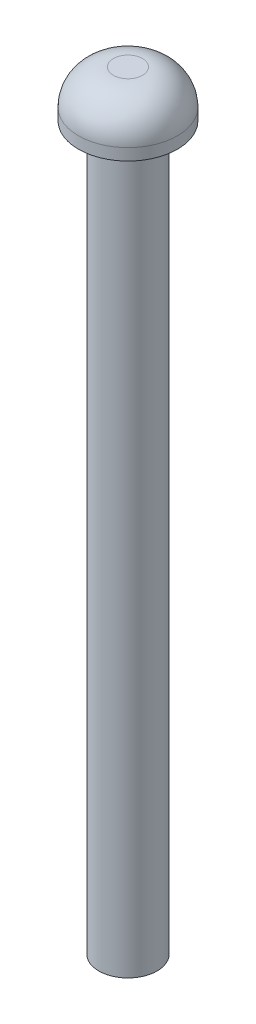
ISO-10303-21;
HEADER;
FILE_DESCRIPTION(('STEP AP214'),'2;1');
FILE_NAME('part.step','',(''),(''),'','','');
FILE_SCHEMA(('AUTOMOTIVE_DESIGN { 1 0 10303 214 1 1 1 1 }'));
ENDSEC;
DATA;
#1=APPLICATION_CONTEXT('core data for automotive mechanical design processes');
#2=APPLICATION_PROTOCOL_DEFINITION('international standard','automotive_design',2000,#1);
#3=PRODUCT_CONTEXT('',#1,'mechanical');
#4=PRODUCT('Part','Part','',(#3));
#5=PRODUCT_RELATED_PRODUCT_CATEGORY('part','',(#4));
#6=PRODUCT_DEFINITION_FORMATION('','',#4);
#7=PRODUCT_DEFINITION_CONTEXT('part definition',#1,'design');
#8=PRODUCT_DEFINITION('design','',#6,#7);
#9=PRODUCT_DEFINITION_SHAPE('','',#8);
#10=(LENGTH_UNIT() NAMED_UNIT(*) SI_UNIT(.MILLI.,.METRE.));
#11=(NAMED_UNIT(*) PLANE_ANGLE_UNIT() SI_UNIT($,.RADIAN.));
#12=(NAMED_UNIT(*) SI_UNIT($,.STERADIAN.) SOLID_ANGLE_UNIT());
#13=UNCERTAINTY_MEASURE_WITH_UNIT(LENGTH_MEASURE(1.E-05),#10,'distance_accuracy_value','');
#14=(GEOMETRIC_REPRESENTATION_CONTEXT(3) GLOBAL_UNCERTAINTY_ASSIGNED_CONTEXT((#13)) GLOBAL_UNIT_ASSIGNED_CONTEXT((#10,
#11,#12)) REPRESENTATION_CONTEXT('',''));
#15=CARTESIAN_POINT('',(0.,0.,0.));
#16=DIRECTION('',(0.,0.,1.));
#17=DIRECTION('',(1.,0.,0.));
#18=AXIS2_PLACEMENT_3D('',#15,#16,#17);
#19=CARTESIAN_POINT('',(0.,62.,0.));
#20=DIRECTION('',(0.,-1.,0.));
#21=DIRECTION('',(0.,0.,-1.));
#22=AXIS2_PLACEMENT_3D('',#19,#20,#21);
#23=CYLINDRICAL_SURFACE('',#22,2.5);
#24=CARTESIAN_POINT('',(0.,62.,0.));
#25=DIRECTION('',(0.,1.,0.));
#26=DIRECTION('',(0.,0.,1.));
#27=AXIS2_PLACEMENT_3D('',#24,#25,#26);
#28=CIRCLE('',#27,2.5);
#29=CARTESIAN_POINT('',(0.,62.,2.5));
#30=VERTEX_POINT('',#29);
#31=EDGE_CURVE('E50',#30,#30,#28,.T.);
#32=ORIENTED_EDGE('',*,*,#31,.F.);
#33=EDGE_LOOP('',(#32));
#34=FACE_BOUND('',#33,.T.);
#35=CARTESIAN_POINT('',(0.,0.,0.));
#36=DIRECTION('',(0.,1.,0.));
#37=DIRECTION('',(0.,0.,1.));
#38=AXIS2_PLACEMENT_3D('',#35,#36,#37);
#39=CIRCLE('',#38,2.5);
#40=CARTESIAN_POINT('',(0.,0.,2.5));
#41=VERTEX_POINT('',#40);
#42=EDGE_CURVE('E55',#41,#41,#39,.T.);
#43=ORIENTED_EDGE('',*,*,#42,.T.);
#44=EDGE_LOOP('',(#43));
#45=FACE_BOUND('',#44,.T.);
#46=ADVANCED_FACE('F37',(#34,#45),#23,.T.);
#47=CARTESIAN_POINT('',(0.,0.,0.));
#48=DIRECTION('',(0.,1.,0.));
#49=DIRECTION('',(0.,0.,1.));
#50=AXIS2_PLACEMENT_3D('',#47,#48,#49);
#51=PLANE('',#50);
#52=ORIENTED_EDGE('',*,*,#42,.F.);
#53=EDGE_LOOP('',(#52));
#54=FACE_BOUND('',#53,.T.);
#55=ADVANCED_FACE('F81',(#54),#51,.F.);
#56=CARTESIAN_POINT('',(0.,66.,0.));
#57=DIRECTION('',(0.,-1.,0.));
#58=DIRECTION('',(0.,0.,-1.));
#59=AXIS2_PLACEMENT_3D('',#56,#57,#58);
#60=CYLINDRICAL_SURFACE('',#59,4.25);
#61=CARTESIAN_POINT('',(0.,63.,0.));
#62=DIRECTION('',(0.,1.,0.));
#63=DIRECTION('',(0.,0.,1.));
#64=AXIS2_PLACEMENT_3D('',#61,#62,#63);
#65=CIRCLE('',#64,4.25);
#66=CARTESIAN_POINT('',(0.,63.,4.25));
#67=VERTEX_POINT('',#66);
#68=EDGE_CURVE('E10',#67,#67,#65,.F.);
#69=ORIENTED_EDGE('',*,*,#68,.T.);
#70=EDGE_LOOP('',(#69));
#71=FACE_BOUND('',#70,.T.);
#72=CARTESIAN_POINT('',(0.,62.,0.));
#73=DIRECTION('',(0.,1.,0.));
#74=DIRECTION('',(0.,0.,1.));
#75=AXIS2_PLACEMENT_3D('',#72,#73,#74);
#76=CIRCLE('',#75,4.25);
#77=CARTESIAN_POINT('',(0.,62.,4.25));
#78=VERTEX_POINT('',#77);
#79=EDGE_CURVE('E60',#78,#78,#76,.T.);
#80=ORIENTED_EDGE('',*,*,#79,.T.);
#81=EDGE_LOOP('',(#80));
#82=FACE_BOUND('',#81,.T.);
#83=ADVANCED_FACE('F66',(#71,#82),#60,.T.);
#84=CARTESIAN_POINT('',(0.,66.,0.));
#85=DIRECTION('',(0.,1.,0.));
#86=DIRECTION('',(0.,0.,1.));
#87=AXIS2_PLACEMENT_3D('',#84,#85,#86);
#88=PLANE('',#87);
#89=CARTESIAN_POINT('',(0.,66.,0.));
#90=DIRECTION('',(0.,1.,0.));
#91=DIRECTION('',(0.,0.,1.));
#92=AXIS2_PLACEMENT_3D('',#89,#90,#91);
#93=CIRCLE('',#92,1.25);
#94=CARTESIAN_POINT('',(0.,66.,1.25));
#95=VERTEX_POINT('',#94);
#96=EDGE_CURVE('E45',#95,#95,#93,.T.);
#97=ORIENTED_EDGE('',*,*,#96,.T.);
#98=EDGE_LOOP('',(#97));
#99=FACE_BOUND('',#98,.T.);
#100=ADVANCED_FACE('F70',(#99),#88,.T.);
#101=CARTESIAN_POINT('',(0.,62.,0.));
#102=DIRECTION('',(0.,1.,0.));
#103=DIRECTION('',(0.,0.,1.));
#104=AXIS2_PLACEMENT_3D('',#101,#102,#103);
#105=PLANE('',#104);
#106=ORIENTED_EDGE('',*,*,#31,.T.);
#107=EDGE_LOOP('',(#106));
#108=FACE_BOUND('',#107,.T.);
#109=ORIENTED_EDGE('',*,*,#79,.F.);
#110=EDGE_LOOP('',(#109));
#111=FACE_BOUND('',#110,.T.);
#112=ADVANCED_FACE('F68',(#108,#111),#105,.F.);
#113=CARTESIAN_POINT('',(0.,63.,0.));
#114=DIRECTION('',(0.,1.,0.));
#115=DIRECTION('',(0.,0.,1.));
#116=AXIS2_PLACEMENT_3D('',#113,#114,#115);
#117=DEGENERATE_TOROIDAL_SURFACE('',#116,1.25,3.,.T.);
#118=ORIENTED_EDGE('',*,*,#68,.F.);
#119=EDGE_LOOP('',(#118));
#120=FACE_BOUND('',#119,.T.);
#121=ORIENTED_EDGE('',*,*,#96,.F.);
#122=EDGE_LOOP('',(#121));
#123=FACE_BOUND('',#122,.T.);
#124=ADVANCED_FACE('F39',(#120,#123),#117,.T.);
#125=CLOSED_SHELL('',(#46,#55,#83,#100,#112,#124));
#126=MANIFOLD_SOLID_BREP('B2',#125);
#127=ADVANCED_BREP_SHAPE_REPRESENTATION('',(#18,#126),#14);
#128=SHAPE_DEFINITION_REPRESENTATION(#9,#127);
ENDSEC;
END-ISO-10303-21;
